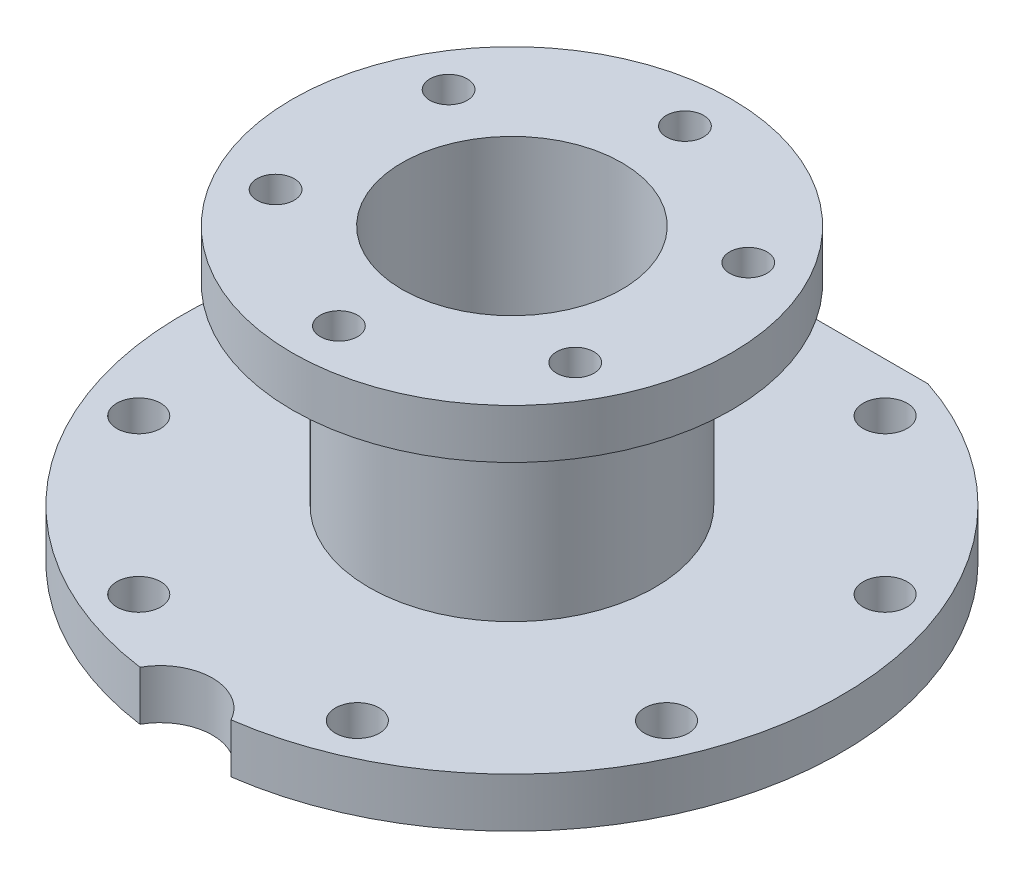
ISO-10303-21;
HEADER;
FILE_DESCRIPTION(('STEP AP214'),'2;1');
FILE_NAME('part.step','',(''),(''),'','','');
FILE_SCHEMA(('AUTOMOTIVE_DESIGN { 1 0 10303 214 1 1 1 1 }'));
ENDSEC;
DATA;
#1=APPLICATION_CONTEXT('core data for automotive mechanical design processes');
#2=APPLICATION_PROTOCOL_DEFINITION('international standard','automotive_design',2000,#1);
#3=PRODUCT_CONTEXT('',#1,'mechanical');
#4=PRODUCT('Part','Part','',(#3));
#5=PRODUCT_RELATED_PRODUCT_CATEGORY('part','',(#4));
#6=PRODUCT_DEFINITION_FORMATION('','',#4);
#7=PRODUCT_DEFINITION_CONTEXT('part definition',#1,'design');
#8=PRODUCT_DEFINITION('design','',#6,#7);
#9=PRODUCT_DEFINITION_SHAPE('','',#8);
#10=(LENGTH_UNIT() NAMED_UNIT(*) SI_UNIT(.MILLI.,.METRE.));
#11=(NAMED_UNIT(*) PLANE_ANGLE_UNIT() SI_UNIT($,.RADIAN.));
#12=(NAMED_UNIT(*) SI_UNIT($,.STERADIAN.) SOLID_ANGLE_UNIT());
#13=UNCERTAINTY_MEASURE_WITH_UNIT(LENGTH_MEASURE(1.E-05),#10,'distance_accuracy_value','');
#14=(GEOMETRIC_REPRESENTATION_CONTEXT(3) GLOBAL_UNCERTAINTY_ASSIGNED_CONTEXT((#13)) GLOBAL_UNIT_ASSIGNED_CONTEXT((#10,
#11,#12)) REPRESENTATION_CONTEXT('',''));
#15=CARTESIAN_POINT('',(0.,0.,0.));
#16=DIRECTION('',(0.,0.,1.));
#17=DIRECTION('',(1.,0.,0.));
#18=AXIS2_PLACEMENT_3D('',#15,#16,#17);
#19=CARTESIAN_POINT('',(0.,0.,0.));
#20=DIRECTION('',(0.,1.,0.));
#21=DIRECTION('',(0.,0.,1.));
#22=AXIS2_PLACEMENT_3D('',#19,#20,#21);
#23=CYLINDRICAL_SURFACE('',#22,20.);
#24=CARTESIAN_POINT('',(0.,53.,0.));
#25=DIRECTION('',(0.,1.,0.));
#26=DIRECTION('',(0.,0.,1.));
#27=AXIS2_PLACEMENT_3D('',#24,#25,#26);
#28=CIRCLE('',#27,20.);
#29=CARTESIAN_POINT('',(0.,53.,20.));
#30=VERTEX_POINT('',#29);
#31=EDGE_CURVE('E133',#30,#30,#28,.T.);
#32=ORIENTED_EDGE('',*,*,#31,.T.);
#33=EDGE_LOOP('',(#32));
#34=FACE_BOUND('',#33,.T.);
#35=CARTESIAN_POINT('',(0.,6.,0.));
#36=DIRECTION('',(0.,-1.,0.));
#37=DIRECTION('',(0.,0.,-1.));
#38=AXIS2_PLACEMENT_3D('',#35,#36,#37);
#39=CIRCLE('',#38,20.);
#40=CARTESIAN_POINT('',(0.,6.,-20.));
#41=VERTEX_POINT('',#40);
#42=EDGE_CURVE('E130',#41,#41,#39,.F.);
#43=ORIENTED_EDGE('',*,*,#42,.F.);
#44=EDGE_LOOP('',(#43));
#45=FACE_BOUND('',#44,.T.);
#46=ADVANCED_FACE('F43',(#34,#45),#23,.F.);
#47=CARTESIAN_POINT('',(0.,9.,0.));
#48=DIRECTION('',(0.,1.,0.));
#49=DIRECTION('',(0.,0.,1.));
#50=AXIS2_PLACEMENT_3D('',#47,#48,#49);
#51=PLANE('',#50);
#52=CARTESIAN_POINT('',(0.,9.,-31.5));
#53=DIRECTION('',(0.,1.,0.));
#54=DIRECTION('',(0.,0.,1.));
#55=AXIS2_PLACEMENT_3D('',#52,#53,#54);
#56=CIRCLE('',#55,1.5);
#57=CARTESIAN_POINT('',(0.,9.,-30.));
#58=VERTEX_POINT('',#57);
#59=EDGE_CURVE('E149',#58,#58,#56,.T.);
#60=ORIENTED_EDGE('',*,*,#59,.F.);
#61=EDGE_LOOP('',(#60));
#62=FACE_BOUND('',#61,.T.);
#63=CARTESIAN_POINT('',(0.,9.,0.));
#64=DIRECTION('',(0.,1.,0.));
#65=DIRECTION('',(0.,0.,1.));
#66=AXIS2_PLACEMENT_3D('',#63,#64,#65);
#67=CIRCLE('',#66,26.);
#68=CARTESIAN_POINT('',(0.,9.,26.));
#69=VERTEX_POINT('',#68);
#70=EDGE_CURVE('E205',#69,#69,#67,.T.);
#71=ORIENTED_EDGE('',*,*,#70,.F.);
#72=EDGE_LOOP('',(#71));
#73=FACE_BOUND('',#72,.T.);
#74=CARTESIAN_POINT('',(-19.8995384829828,9.,48.0417356905861));
#75=DIRECTION('',(0.,1.,0.));
#76=DIRECTION('',(0.,0.,1.));
#77=AXIS2_PLACEMENT_3D('',#74,#75,#76);
#78=CIRCLE('',#77,4.00000000000016);
#79=CARTESIAN_POINT('',(-19.8995384829828,9.,52.0417356905863));
#80=VERTEX_POINT('',#79);
#81=EDGE_CURVE('E225',#80,#80,#78,.T.);
#82=ORIENTED_EDGE('',*,*,#81,.F.);
#83=EDGE_LOOP('',(#82));
#84=FACE_BOUND('',#83,.T.);
#85=CARTESIAN_POINT('',(48.041735690588,9.,19.899538482982));
#86=DIRECTION('',(0.,1.,0.));
#87=DIRECTION('',(0.,0.,1.));
#88=AXIS2_PLACEMENT_3D('',#85,#86,#87);
#89=CIRCLE('',#88,4.00000000000213);
#90=CARTESIAN_POINT('',(48.041735690588,9.,23.8995384829841));
#91=VERTEX_POINT('',#90);
#92=EDGE_CURVE('E241',#91,#91,#89,.T.);
#93=ORIENTED_EDGE('',*,*,#92,.F.);
#94=EDGE_LOOP('',(#93));
#95=FACE_BOUND('',#94,.T.);
#96=CARTESIAN_POINT('',(19.8995384829839,9.,-48.0417356905888));
#97=DIRECTION('',(0.,1.,0.));
#98=DIRECTION('',(0.,0.,1.));
#99=AXIS2_PLACEMENT_3D('',#96,#97,#98);
#100=CIRCLE('',#99,4.00000000000223);
#101=CARTESIAN_POINT('',(19.8995384829839,9.,-44.0417356905866));
#102=VERTEX_POINT('',#101);
#103=EDGE_CURVE('E257',#102,#102,#100,.T.);
#104=ORIENTED_EDGE('',*,*,#103,.F.);
#105=EDGE_LOOP('',(#104));
#106=FACE_BOUND('',#105,.T.);
#107=CARTESIAN_POINT('',(-48.0417356905869,9.,-19.8995384829847));
#108=DIRECTION('',(0.,1.,0.));
#109=DIRECTION('',(0.,0.,1.));
#110=AXIS2_PLACEMENT_3D('',#107,#108,#109);
#111=CIRCLE('',#110,4.);
#112=CARTESIAN_POINT('',(-48.0417356905869,9.,-15.8995384829847));
#113=VERTEX_POINT('',#112);
#114=EDGE_CURVE('E120',#113,#113,#111,.T.);
#115=ORIENTED_EDGE('',*,*,#114,.F.);
#116=EDGE_LOOP('',(#115));
#117=FACE_BOUND('',#116,.T.);
#118=CARTESIAN_POINT('',(0.,9.,0.));
#119=DIRECTION('',(0.,1.,0.));
#120=DIRECTION('',(0.,0.,1.));
#121=AXIS2_PLACEMENT_3D('',#118,#119,#120);
#122=CIRCLE('',#121,60.);
#123=CARTESIAN_POINT('',(-18.7349939951952,9.,-57.));
#124=VERTEX_POINT('',#123);
#125=CARTESIAN_POINT('',(-8.29395796204773,9.,59.4239872553482));
#126=VERTEX_POINT('',#125);
#127=EDGE_CURVE('E99',#124,#126,#122,.T.);
#128=ORIENTED_EDGE('',*,*,#127,.T.);
#129=CARTESIAN_POINT('',(0.,9.,64.));
#130=DIRECTION('',(0.,-1.,0.));
#131=DIRECTION('',(0.,0.,1.));
#132=AXIS2_PLACEMENT_3D('',#129,#130,#131);
#133=CIRCLE('',#132,9.4725725816924);
#134=CARTESIAN_POINT('',(8.29395796204773,9.,59.4239872553482));
#135=VERTEX_POINT('',#134);
#136=EDGE_CURVE('E93',#126,#135,#133,.T.);
#137=ORIENTED_EDGE('',*,*,#136,.T.);
#138=CARTESIAN_POINT('',(0.,9.,0.));
#139=DIRECTION('',(0.,1.,0.));
#140=DIRECTION('',(0.,0.,1.));
#141=AXIS2_PLACEMENT_3D('',#138,#139,#140);
#142=CIRCLE('',#141,60.);
#143=CARTESIAN_POINT('',(18.7349939951952,9.,-57.));
#144=VERTEX_POINT('',#143);
#145=EDGE_CURVE('E97',#135,#144,#142,.T.);
#146=ORIENTED_EDGE('',*,*,#145,.T.);
#147=DIRECTION('',(-1.,0.,0.));
#148=VECTOR('',#147,1.);
#149=CARTESIAN_POINT('',(-18.7349939951952,9.,-57.));
#150=LINE('',#149,#148);
#151=EDGE_CURVE('E63',#144,#124,#150,.T.);
#152=ORIENTED_EDGE('',*,*,#151,.T.);
#153=EDGE_LOOP('',(#128,#137,#146,#152));
#154=FACE_BOUND('',#153,.T.);
#155=CARTESIAN_POINT('',(-19.8995384829845,9.,-48.041735690587));
#156=DIRECTION('',(0.,1.,0.));
#157=DIRECTION('',(0.,0.,1.));
#158=AXIS2_PLACEMENT_3D('',#155,#156,#157);
#159=CIRCLE('',#158,4.);
#160=CARTESIAN_POINT('',(-19.8995384829845,9.,-44.041735690587));
#161=VERTEX_POINT('',#160);
#162=EDGE_CURVE('E265',#161,#161,#159,.T.);
#163=ORIENTED_EDGE('',*,*,#162,.F.);
#164=EDGE_LOOP('',(#163));
#165=FACE_BOUND('',#164,.T.);
#166=CARTESIAN_POINT('',(48.0417356905869,9.,-19.8995384829874));
#167=DIRECTION('',(0.,1.,0.));
#168=DIRECTION('',(0.,0.,1.));
#169=AXIS2_PLACEMENT_3D('',#166,#167,#168);
#170=CIRCLE('',#169,4.0000000000026);
#171=CARTESIAN_POINT('',(48.0417356905869,9.,-15.8995384829848));
#172=VERTEX_POINT('',#171);
#173=EDGE_CURVE('E249',#172,#172,#170,.T.);
#174=ORIENTED_EDGE('',*,*,#173,.F.);
#175=EDGE_LOOP('',(#174));
#176=FACE_BOUND('',#175,.T.);
#177=CARTESIAN_POINT('',(19.8995384829866,9.,48.041735690585));
#178=DIRECTION('',(0.,1.,0.));
#179=DIRECTION('',(0.,0.,1.));
#180=AXIS2_PLACEMENT_3D('',#177,#178,#179);
#181=CIRCLE('',#180,4.0000000000011);
#182=CARTESIAN_POINT('',(19.8995384829866,9.,52.0417356905861));
#183=VERTEX_POINT('',#182);
#184=EDGE_CURVE('E233',#183,#183,#181,.T.);
#185=ORIENTED_EDGE('',*,*,#184,.F.);
#186=EDGE_LOOP('',(#185));
#187=FACE_BOUND('',#186,.T.);
#188=CARTESIAN_POINT('',(-48.0417356905872,9.,19.899538482984));
#189=DIRECTION('',(0.,1.,0.));
#190=DIRECTION('',(0.,0.,1.));
#191=AXIS2_PLACEMENT_3D('',#188,#189,#190);
#192=CIRCLE('',#191,4.);
#193=CARTESIAN_POINT('',(-48.0417356905872,9.,23.899538482984));
#194=VERTEX_POINT('',#193);
#195=EDGE_CURVE('E217',#194,#194,#192,.T.);
#196=ORIENTED_EDGE('',*,*,#195,.F.);
#197=EDGE_LOOP('',(#196));
#198=FACE_BOUND('',#197,.T.);
#199=ADVANCED_FACE('F94',(#62,#73,#84,#95,#106,#117,#154,#165,#176,#187,#198),#51,.T.);
#200=CARTESIAN_POINT('',(0.,0.,0.));
#201=DIRECTION('',(0.,1.,0.));
#202=DIRECTION('',(0.,0.,1.));
#203=AXIS2_PLACEMENT_3D('',#200,#201,#202);
#204=PLANE('',#203);
#205=CARTESIAN_POINT('',(0.,0.,0.));
#206=DIRECTION('',(0.,-1.,0.));
#207=DIRECTION('',(0.,0.,-1.));
#208=AXIS2_PLACEMENT_3D('',#205,#206,#207);
#209=CIRCLE('',#208,37.5);
#210=CARTESIAN_POINT('',(0.,0.,-37.5));
#211=VERTEX_POINT('',#210);
#212=EDGE_CURVE('E143',#211,#211,#209,.T.);
#213=ORIENTED_EDGE('',*,*,#212,.F.);
#214=EDGE_LOOP('',(#213));
#215=FACE_BOUND('',#214,.T.);
#216=CARTESIAN_POINT('',(0.,0.,0.));
#217=DIRECTION('',(0.,1.,0.));
#218=DIRECTION('',(0.,0.,1.));
#219=AXIS2_PLACEMENT_3D('',#216,#217,#218);
#220=CIRCLE('',#219,60.);
#221=CARTESIAN_POINT('',(-18.7349939951952,0.,-57.));
#222=VERTEX_POINT('',#221);
#223=CARTESIAN_POINT('',(-8.29395796204773,0.,59.4239872553482));
#224=VERTEX_POINT('',#223);
#225=EDGE_CURVE('E116',#222,#224,#220,.T.);
#226=ORIENTED_EDGE('',*,*,#225,.F.);
#227=DIRECTION('',(-1.,0.,0.));
#228=VECTOR('',#227,1.);
#229=CARTESIAN_POINT('',(-18.7349939951952,0.,-57.));
#230=LINE('',#229,#228);
#231=CARTESIAN_POINT('',(18.7349939951952,0.,-57.));
#232=VERTEX_POINT('',#231);
#233=EDGE_CURVE('E86',#232,#222,#230,.T.);
#234=ORIENTED_EDGE('',*,*,#233,.F.);
#235=CARTESIAN_POINT('',(0.,0.,0.));
#236=DIRECTION('',(0.,1.,0.));
#237=DIRECTION('',(0.,0.,1.));
#238=AXIS2_PLACEMENT_3D('',#235,#236,#237);
#239=CIRCLE('',#238,60.);
#240=CARTESIAN_POINT('',(8.29395796204773,0.,59.4239872553482));
#241=VERTEX_POINT('',#240);
#242=EDGE_CURVE('E80',#241,#232,#239,.T.);
#243=ORIENTED_EDGE('',*,*,#242,.F.);
#244=CARTESIAN_POINT('',(0.,0.,64.));
#245=DIRECTION('',(0.,-1.,0.));
#246=DIRECTION('',(0.,0.,1.));
#247=AXIS2_PLACEMENT_3D('',#244,#245,#246);
#248=CIRCLE('',#247,9.4725725816924);
#249=EDGE_CURVE('E104',#224,#241,#248,.T.);
#250=ORIENTED_EDGE('',*,*,#249,.F.);
#251=EDGE_LOOP('',(#226,#234,#243,#250));
#252=FACE_BOUND('',#251,.T.);
#253=CARTESIAN_POINT('',(-48.0417356905869,0.,-19.8995384829847));
#254=DIRECTION('',(0.,1.,0.));
#255=DIRECTION('',(0.,0.,1.));
#256=AXIS2_PLACEMENT_3D('',#253,#254,#255);
#257=CIRCLE('',#256,4.);
#258=CARTESIAN_POINT('',(-48.0417356905869,0.,-15.8995384829847));
#259=VERTEX_POINT('',#258);
#260=EDGE_CURVE('E269',#259,#259,#257,.T.);
#261=ORIENTED_EDGE('',*,*,#260,.T.);
#262=EDGE_LOOP('',(#261));
#263=FACE_BOUND('',#262,.T.);
#264=CARTESIAN_POINT('',(-19.8995384829845,0.,-48.041735690587));
#265=DIRECTION('',(0.,1.,0.));
#266=DIRECTION('',(0.,0.,1.));
#267=AXIS2_PLACEMENT_3D('',#264,#265,#266);
#268=CIRCLE('',#267,4.);
#269=CARTESIAN_POINT('',(-19.8995384829845,0.,-44.041735690587));
#270=VERTEX_POINT('',#269);
#271=EDGE_CURVE('E261',#270,#270,#268,.T.);
#272=ORIENTED_EDGE('',*,*,#271,.T.);
#273=EDGE_LOOP('',(#272));
#274=FACE_BOUND('',#273,.T.);
#275=CARTESIAN_POINT('',(19.8995384829839,0.,-48.0417356905888));
#276=DIRECTION('',(0.,1.,0.));
#277=DIRECTION('',(0.,0.,1.));
#278=AXIS2_PLACEMENT_3D('',#275,#276,#277);
#279=CIRCLE('',#278,4.00000000000223);
#280=CARTESIAN_POINT('',(19.8995384829839,0.,-44.0417356905866));
#281=VERTEX_POINT('',#280);
#282=EDGE_CURVE('E253',#281,#281,#279,.T.);
#283=ORIENTED_EDGE('',*,*,#282,.T.);
#284=EDGE_LOOP('',(#283));
#285=FACE_BOUND('',#284,.T.);
#286=CARTESIAN_POINT('',(48.0417356905869,0.,-19.8995384829874));
#287=DIRECTION('',(0.,1.,0.));
#288=DIRECTION('',(0.,0.,1.));
#289=AXIS2_PLACEMENT_3D('',#286,#287,#288);
#290=CIRCLE('',#289,4.0000000000026);
#291=CARTESIAN_POINT('',(48.0417356905869,0.,-15.8995384829848));
#292=VERTEX_POINT('',#291);
#293=EDGE_CURVE('E245',#292,#292,#290,.T.);
#294=ORIENTED_EDGE('',*,*,#293,.T.);
#295=EDGE_LOOP('',(#294));
#296=FACE_BOUND('',#295,.T.);
#297=CARTESIAN_POINT('',(48.041735690588,0.,19.899538482982));
#298=DIRECTION('',(0.,1.,0.));
#299=DIRECTION('',(0.,0.,1.));
#300=AXIS2_PLACEMENT_3D('',#297,#298,#299);
#301=CIRCLE('',#300,4.00000000000213);
#302=CARTESIAN_POINT('',(48.041735690588,0.,23.8995384829841));
#303=VERTEX_POINT('',#302);
#304=EDGE_CURVE('E237',#303,#303,#301,.T.);
#305=ORIENTED_EDGE('',*,*,#304,.T.);
#306=EDGE_LOOP('',(#305));
#307=FACE_BOUND('',#306,.T.);
#308=CARTESIAN_POINT('',(19.8995384829866,0.,48.041735690585));
#309=DIRECTION('',(0.,1.,0.));
#310=DIRECTION('',(0.,0.,1.));
#311=AXIS2_PLACEMENT_3D('',#308,#309,#310);
#312=CIRCLE('',#311,4.0000000000011);
#313=CARTESIAN_POINT('',(19.8995384829866,0.,52.0417356905861));
#314=VERTEX_POINT('',#313);
#315=EDGE_CURVE('E229',#314,#314,#312,.T.);
#316=ORIENTED_EDGE('',*,*,#315,.T.);
#317=EDGE_LOOP('',(#316));
#318=FACE_BOUND('',#317,.T.);
#319=CARTESIAN_POINT('',(-19.8995384829828,0.,48.0417356905861));
#320=DIRECTION('',(0.,1.,0.));
#321=DIRECTION('',(0.,0.,1.));
#322=AXIS2_PLACEMENT_3D('',#319,#320,#321);
#323=CIRCLE('',#322,4.00000000000016);
#324=CARTESIAN_POINT('',(-19.8995384829828,0.,52.0417356905863));
#325=VERTEX_POINT('',#324);
#326=EDGE_CURVE('E221',#325,#325,#323,.T.);
#327=ORIENTED_EDGE('',*,*,#326,.T.);
#328=EDGE_LOOP('',(#327));
#329=FACE_BOUND('',#328,.T.);
#330=CARTESIAN_POINT('',(-48.0417356905872,0.,19.899538482984));
#331=DIRECTION('',(0.,1.,0.));
#332=DIRECTION('',(0.,0.,1.));
#333=AXIS2_PLACEMENT_3D('',#330,#331,#332);
#334=CIRCLE('',#333,4.);
#335=CARTESIAN_POINT('',(-48.0417356905872,0.,23.899538482984));
#336=VERTEX_POINT('',#335);
#337=EDGE_CURVE('E213',#336,#336,#334,.T.);
#338=ORIENTED_EDGE('',*,*,#337,.T.);
#339=EDGE_LOOP('',(#338));
#340=FACE_BOUND('',#339,.T.);
#341=ADVANCED_FACE('F281',(#215,#252,#263,#274,#285,#296,#307,#318,#329,#340),#204,.F.);
#342=CARTESIAN_POINT('',(0.,9.,0.));
#343=DIRECTION('',(0.,-1.,0.));
#344=DIRECTION('',(0.,0.,-1.));
#345=AXIS2_PLACEMENT_3D('',#342,#343,#344);
#346=CYLINDRICAL_SURFACE('',#345,60.);
#347=ORIENTED_EDGE('',*,*,#225,.T.);
#348=DIRECTION('',(0.,-1.,0.));
#349=VECTOR('',#348,1.);
#350=CARTESIAN_POINT('',(-8.29395796204773,9.,59.4239872553482));
#351=LINE('',#350,#349);
#352=EDGE_CURVE('E11',#126,#224,#351,.T.);
#353=ORIENTED_EDGE('',*,*,#352,.F.);
#354=ORIENTED_EDGE('',*,*,#127,.F.);
#355=DIRECTION('',(0.,-1.,0.));
#356=VECTOR('',#355,1.);
#357=CARTESIAN_POINT('',(-18.7349939951952,9.,-57.));
#358=LINE('',#357,#356);
#359=EDGE_CURVE('E112',#124,#222,#358,.T.);
#360=ORIENTED_EDGE('',*,*,#359,.T.);
#361=EDGE_LOOP('',(#347,#353,#354,#360));
#362=FACE_BOUND('',#361,.T.);
#363=ADVANCED_FACE('F45',(#362),#346,.T.);
#364=CARTESIAN_POINT('',(0.,9.,64.));
#365=DIRECTION('',(0.,-1.,0.));
#366=DIRECTION('',(0.,0.,-1.));
#367=AXIS2_PLACEMENT_3D('',#364,#365,#366);
#368=CYLINDRICAL_SURFACE('',#367,9.4725725816924);
#369=ORIENTED_EDGE('',*,*,#249,.T.);
#370=DIRECTION('',(0.,-1.,0.));
#371=VECTOR('',#370,1.);
#372=CARTESIAN_POINT('',(8.29395796204773,9.,59.4239872553482));
#373=LINE('',#372,#371);
#374=EDGE_CURVE('E54',#135,#241,#373,.T.);
#375=ORIENTED_EDGE('',*,*,#374,.F.);
#376=ORIENTED_EDGE('',*,*,#136,.F.);
#377=ORIENTED_EDGE('',*,*,#352,.T.);
#378=EDGE_LOOP('',(#369,#375,#376,#377));
#379=FACE_BOUND('',#378,.T.);
#380=ADVANCED_FACE('F103',(#379),#368,.F.);
#381=CARTESIAN_POINT('',(0.,9.,0.));
#382=DIRECTION('',(0.,-1.,0.));
#383=DIRECTION('',(0.,0.,-1.));
#384=AXIS2_PLACEMENT_3D('',#381,#382,#383);
#385=CYLINDRICAL_SURFACE('',#384,60.);
#386=ORIENTED_EDGE('',*,*,#242,.T.);
#387=DIRECTION('',(0.,-1.,0.));
#388=VECTOR('',#387,1.);
#389=CARTESIAN_POINT('',(18.7349939951952,9.,-57.));
#390=LINE('',#389,#388);
#391=EDGE_CURVE('E106',#144,#232,#390,.T.);
#392=ORIENTED_EDGE('',*,*,#391,.F.);
#393=ORIENTED_EDGE('',*,*,#145,.F.);
#394=ORIENTED_EDGE('',*,*,#374,.T.);
#395=EDGE_LOOP('',(#386,#392,#393,#394));
#396=FACE_BOUND('',#395,.T.);
#397=ADVANCED_FACE('F108',(#396),#385,.T.);
#398=CARTESIAN_POINT('',(-18.7349939951952,9.,-57.));
#399=DIRECTION('',(0.,0.,1.));
#400=DIRECTION('',(1.,0.,0.));
#401=AXIS2_PLACEMENT_3D('',#398,#399,#400);
#402=PLANE('',#401);
#403=ORIENTED_EDGE('',*,*,#233,.T.);
#404=ORIENTED_EDGE('',*,*,#359,.F.);
#405=ORIENTED_EDGE('',*,*,#151,.F.);
#406=ORIENTED_EDGE('',*,*,#391,.T.);
#407=EDGE_LOOP('',(#403,#404,#405,#406));
#408=FACE_BOUND('',#407,.T.);
#409=ADVANCED_FACE('F287',(#408),#402,.F.);
#410=CARTESIAN_POINT('',(-48.0417356905869,9.,-19.8995384829847));
#411=DIRECTION('',(0.,-1.,0.));
#412=DIRECTION('',(0.,0.,-1.));
#413=AXIS2_PLACEMENT_3D('',#410,#411,#412);
#414=CYLINDRICAL_SURFACE('',#413,4.);
#415=ORIENTED_EDGE('',*,*,#114,.T.);
#416=EDGE_LOOP('',(#415));
#417=FACE_BOUND('',#416,.T.);
#418=ORIENTED_EDGE('',*,*,#260,.F.);
#419=EDGE_LOOP('',(#418));
#420=FACE_BOUND('',#419,.T.);
#421=ADVANCED_FACE('F284',(#417,#420),#414,.F.);
#422=CARTESIAN_POINT('',(-19.8995384829845,9.,-48.041735690587));
#423=DIRECTION('',(0.,-1.,0.));
#424=DIRECTION('',(0.,0.,-1.));
#425=AXIS2_PLACEMENT_3D('',#422,#423,#424);
#426=CYLINDRICAL_SURFACE('',#425,4.);
#427=ORIENTED_EDGE('',*,*,#162,.T.);
#428=EDGE_LOOP('',(#427));
#429=FACE_BOUND('',#428,.T.);
#430=ORIENTED_EDGE('',*,*,#271,.F.);
#431=EDGE_LOOP('',(#430));
#432=FACE_BOUND('',#431,.T.);
#433=ADVANCED_FACE('F286',(#429,#432),#426,.F.);
#434=CARTESIAN_POINT('',(19.8995384829839,9.,-48.0417356905888));
#435=DIRECTION('',(0.,-1.,0.));
#436=DIRECTION('',(0.,0.,-1.));
#437=AXIS2_PLACEMENT_3D('',#434,#435,#436);
#438=CYLINDRICAL_SURFACE('',#437,4.00000000000223);
#439=ORIENTED_EDGE('',*,*,#103,.T.);
#440=EDGE_LOOP('',(#439));
#441=FACE_BOUND('',#440,.T.);
#442=ORIENTED_EDGE('',*,*,#282,.F.);
#443=EDGE_LOOP('',(#442));
#444=FACE_BOUND('',#443,.T.);
#445=ADVANCED_FACE('F294',(#441,#444),#438,.F.);
#446=CARTESIAN_POINT('',(48.0417356905869,9.,-19.8995384829874));
#447=DIRECTION('',(0.,-1.,0.));
#448=DIRECTION('',(0.,0.,-1.));
#449=AXIS2_PLACEMENT_3D('',#446,#447,#448);
#450=CYLINDRICAL_SURFACE('',#449,4.0000000000026);
#451=ORIENTED_EDGE('',*,*,#173,.T.);
#452=EDGE_LOOP('',(#451));
#453=FACE_BOUND('',#452,.T.);
#454=ORIENTED_EDGE('',*,*,#293,.F.);
#455=EDGE_LOOP('',(#454));
#456=FACE_BOUND('',#455,.T.);
#457=ADVANCED_FACE('F367',(#453,#456),#450,.F.);
#458=CARTESIAN_POINT('',(48.041735690588,9.,19.899538482982));
#459=DIRECTION('',(0.,-1.,0.));
#460=DIRECTION('',(0.,0.,-1.));
#461=AXIS2_PLACEMENT_3D('',#458,#459,#460);
#462=CYLINDRICAL_SURFACE('',#461,4.00000000000213);
#463=ORIENTED_EDGE('',*,*,#92,.T.);
#464=EDGE_LOOP('',(#463));
#465=FACE_BOUND('',#464,.T.);
#466=ORIENTED_EDGE('',*,*,#304,.F.);
#467=EDGE_LOOP('',(#466));
#468=FACE_BOUND('',#467,.T.);
#469=ADVANCED_FACE('F363',(#465,#468),#462,.F.);
#470=CARTESIAN_POINT('',(19.8995384829866,9.,48.041735690585));
#471=DIRECTION('',(0.,-1.,0.));
#472=DIRECTION('',(0.,0.,-1.));
#473=AXIS2_PLACEMENT_3D('',#470,#471,#472);
#474=CYLINDRICAL_SURFACE('',#473,4.0000000000011);
#475=ORIENTED_EDGE('',*,*,#184,.T.);
#476=EDGE_LOOP('',(#475));
#477=FACE_BOUND('',#476,.T.);
#478=ORIENTED_EDGE('',*,*,#315,.F.);
#479=EDGE_LOOP('',(#478));
#480=FACE_BOUND('',#479,.T.);
#481=ADVANCED_FACE('F359',(#477,#480),#474,.F.);
#482=CARTESIAN_POINT('',(-19.8995384829828,9.,48.0417356905861));
#483=DIRECTION('',(0.,-1.,0.));
#484=DIRECTION('',(0.,0.,-1.));
#485=AXIS2_PLACEMENT_3D('',#482,#483,#484);
#486=CYLINDRICAL_SURFACE('',#485,4.00000000000016);
#487=ORIENTED_EDGE('',*,*,#81,.T.);
#488=EDGE_LOOP('',(#487));
#489=FACE_BOUND('',#488,.T.);
#490=ORIENTED_EDGE('',*,*,#326,.F.);
#491=EDGE_LOOP('',(#490));
#492=FACE_BOUND('',#491,.T.);
#493=ADVANCED_FACE('F355',(#489,#492),#486,.F.);
#494=CARTESIAN_POINT('',(-48.0417356905872,9.,19.899538482984));
#495=DIRECTION('',(0.,-1.,0.));
#496=DIRECTION('',(0.,0.,-1.));
#497=AXIS2_PLACEMENT_3D('',#494,#495,#496);
#498=CYLINDRICAL_SURFACE('',#497,4.);
#499=ORIENTED_EDGE('',*,*,#195,.T.);
#500=EDGE_LOOP('',(#499));
#501=FACE_BOUND('',#500,.T.);
#502=ORIENTED_EDGE('',*,*,#337,.F.);
#503=EDGE_LOOP('',(#502));
#504=FACE_BOUND('',#503,.T.);
#505=ADVANCED_FACE('F351',(#501,#504),#498,.F.);
#506=CARTESIAN_POINT('',(0.,44.,0.));
#507=DIRECTION('',(0.,-1.,0.));
#508=DIRECTION('',(0.,0.,-1.));
#509=AXIS2_PLACEMENT_3D('',#506,#507,#508);
#510=CYLINDRICAL_SURFACE('',#509,26.);
#511=CARTESIAN_POINT('',(0.,44.,0.));
#512=DIRECTION('',(0.,1.,0.));
#513=DIRECTION('',(0.,0.,1.));
#514=AXIS2_PLACEMENT_3D('',#511,#512,#513);
#515=CIRCLE('',#514,26.);
#516=CARTESIAN_POINT('',(0.,44.,26.));
#517=VERTEX_POINT('',#516);
#518=EDGE_CURVE('E209',#517,#517,#515,.T.);
#519=ORIENTED_EDGE('',*,*,#518,.F.);
#520=EDGE_LOOP('',(#519));
#521=FACE_BOUND('',#520,.T.);
#522=ORIENTED_EDGE('',*,*,#70,.T.);
#523=EDGE_LOOP('',(#522));
#524=FACE_BOUND('',#523,.T.);
#525=ADVANCED_FACE('F347',(#521,#524),#510,.T.);
#526=CARTESIAN_POINT('',(0.,53.,0.));
#527=DIRECTION('',(0.,-1.,0.));
#528=DIRECTION('',(0.,0.,-1.));
#529=AXIS2_PLACEMENT_3D('',#526,#527,#528);
#530=CYLINDRICAL_SURFACE('',#529,40.);
#531=CARTESIAN_POINT('',(0.,53.,0.));
#532=DIRECTION('',(0.,1.,0.));
#533=DIRECTION('',(0.,0.,1.));
#534=AXIS2_PLACEMENT_3D('',#531,#532,#533);
#535=CIRCLE('',#534,40.);
#536=CARTESIAN_POINT('',(0.,53.,40.));
#537=VERTEX_POINT('',#536);
#538=EDGE_CURVE('E201',#537,#537,#535,.T.);
#539=ORIENTED_EDGE('',*,*,#538,.F.);
#540=EDGE_LOOP('',(#539));
#541=FACE_BOUND('',#540,.T.);
#542=CARTESIAN_POINT('',(0.,44.,0.));
#543=DIRECTION('',(0.,1.,0.));
#544=DIRECTION('',(0.,0.,1.));
#545=AXIS2_PLACEMENT_3D('',#542,#543,#544);
#546=CIRCLE('',#545,40.);
#547=CARTESIAN_POINT('',(0.,44.,40.));
#548=VERTEX_POINT('',#547);
#549=EDGE_CURVE('E200',#548,#548,#546,.T.);
#550=ORIENTED_EDGE('',*,*,#549,.T.);
#551=EDGE_LOOP('',(#550));
#552=FACE_BOUND('',#551,.T.);
#553=ADVANCED_FACE('F340',(#541,#552),#530,.T.);
#554=CARTESIAN_POINT('',(0.,53.,0.));
#555=DIRECTION('',(0.,1.,0.));
#556=DIRECTION('',(0.,0.,1.));
#557=AXIS2_PLACEMENT_3D('',#554,#555,#556);
#558=PLANE('',#557);
#559=ORIENTED_EDGE('',*,*,#31,.F.);
#560=EDGE_LOOP('',(#559));
#561=FACE_BOUND('',#560,.T.);
#562=CARTESIAN_POINT('',(-27.2798002192096,53.,-15.7500000000003));
#563=DIRECTION('',(0.,1.,0.));
#564=DIRECTION('',(0.,0.,1.));
#565=AXIS2_PLACEMENT_3D('',#562,#563,#564);
#566=CIRCLE('',#565,3.39999999999999);
#567=CARTESIAN_POINT('',(-27.2798002192096,53.,-12.3500000000003));
#568=VERTEX_POINT('',#567);
#569=EDGE_CURVE('E140',#568,#568,#566,.T.);
#570=ORIENTED_EDGE('',*,*,#569,.F.);
#571=EDGE_LOOP('',(#570));
#572=FACE_BOUND('',#571,.T.);
#573=CARTESIAN_POINT('',(-27.27980021921,53.,15.7499999999997));
#574=DIRECTION('',(0.,1.,0.));
#575=DIRECTION('',(0.,0.,1.));
#576=AXIS2_PLACEMENT_3D('',#573,#574,#575);
#577=CIRCLE('',#576,3.39999999999999);
#578=CARTESIAN_POINT('',(-27.27980021921,53.,19.1499999999997));
#579=VERTEX_POINT('',#578);
#580=EDGE_CURVE('E160',#579,#579,#577,.T.);
#581=ORIENTED_EDGE('',*,*,#580,.F.);
#582=EDGE_LOOP('',(#581));
#583=FACE_BOUND('',#582,.T.);
#584=CARTESIAN_POINT('',(0.,53.,31.5));
#585=DIRECTION('',(0.,1.,0.));
#586=DIRECTION('',(0.,0.,1.));
#587=AXIS2_PLACEMENT_3D('',#584,#585,#586);
#588=CIRCLE('',#587,3.39999999999999);
#589=CARTESIAN_POINT('',(0.,53.,34.9));
#590=VERTEX_POINT('',#589);
#591=EDGE_CURVE('E168',#590,#590,#588,.T.);
#592=ORIENTED_EDGE('',*,*,#591,.F.);
#593=EDGE_LOOP('',(#592));
#594=FACE_BOUND('',#593,.T.);
#595=CARTESIAN_POINT('',(27.2798002192098,53.,15.7500000000001));
#596=DIRECTION('',(0.,1.,0.));
#597=DIRECTION('',(0.,0.,1.));
#598=AXIS2_PLACEMENT_3D('',#595,#596,#597);
#599=CIRCLE('',#598,3.39999999999999);
#600=CARTESIAN_POINT('',(27.2798002192098,53.,19.1500000000001));
#601=VERTEX_POINT('',#600);
#602=EDGE_CURVE('E176',#601,#601,#599,.T.);
#603=ORIENTED_EDGE('',*,*,#602,.F.);
#604=EDGE_LOOP('',(#603));
#605=FACE_BOUND('',#604,.T.);
#606=CARTESIAN_POINT('',(27.2798002192099,53.,-15.7499999999999));
#607=DIRECTION('',(0.,1.,0.));
#608=DIRECTION('',(0.,0.,1.));
#609=AXIS2_PLACEMENT_3D('',#606,#607,#608);
#610=CIRCLE('',#609,3.39999999999999);
#611=CARTESIAN_POINT('',(27.2798002192099,53.,-12.3499999999999));
#612=VERTEX_POINT('',#611);
#613=EDGE_CURVE('E184',#612,#612,#610,.T.);
#614=ORIENTED_EDGE('',*,*,#613,.F.);
#615=EDGE_LOOP('',(#614));
#616=FACE_BOUND('',#615,.T.);
#617=CARTESIAN_POINT('',(0.,53.,-31.5));
#618=DIRECTION('',(0.,1.,0.));
#619=DIRECTION('',(0.,0.,1.));
#620=AXIS2_PLACEMENT_3D('',#617,#618,#619);
#621=CIRCLE('',#620,3.39999999999999);
#622=CARTESIAN_POINT('',(0.,53.,-28.1));
#623=VERTEX_POINT('',#622);
#624=EDGE_CURVE('E192',#623,#623,#621,.T.);
#625=ORIENTED_EDGE('',*,*,#624,.F.);
#626=EDGE_LOOP('',(#625));
#627=FACE_BOUND('',#626,.T.);
#628=ORIENTED_EDGE('',*,*,#538,.T.);
#629=EDGE_LOOP('',(#628));
#630=FACE_BOUND('',#629,.T.);
#631=ADVANCED_FACE('F337',(#561,#572,#583,#594,#605,#616,#627,#630),#558,.T.);
#632=CARTESIAN_POINT('',(0.,44.,0.));
#633=DIRECTION('',(0.,1.,0.));
#634=DIRECTION('',(0.,0.,1.));
#635=AXIS2_PLACEMENT_3D('',#632,#633,#634);
#636=PLANE('',#635);
#637=CARTESIAN_POINT('',(-27.2798002192096,44.,-15.7500000000003));
#638=DIRECTION('',(0.,1.,0.));
#639=DIRECTION('',(0.,0.,1.));
#640=AXIS2_PLACEMENT_3D('',#637,#638,#639);
#641=CIRCLE('',#640,3.39999999999999);
#642=CARTESIAN_POINT('',(-27.2798002192096,44.,-12.3500000000003));
#643=VERTEX_POINT('',#642);
#644=EDGE_CURVE('E156',#643,#643,#641,.T.);
#645=ORIENTED_EDGE('',*,*,#644,.T.);
#646=EDGE_LOOP('',(#645));
#647=FACE_BOUND('',#646,.T.);
#648=CARTESIAN_POINT('',(-27.27980021921,44.,15.7499999999997));
#649=DIRECTION('',(0.,1.,0.));
#650=DIRECTION('',(0.,0.,1.));
#651=AXIS2_PLACEMENT_3D('',#648,#649,#650);
#652=CIRCLE('',#651,3.39999999999999);
#653=CARTESIAN_POINT('',(-27.27980021921,44.,19.1499999999997));
#654=VERTEX_POINT('',#653);
#655=EDGE_CURVE('E164',#654,#654,#652,.T.);
#656=ORIENTED_EDGE('',*,*,#655,.T.);
#657=EDGE_LOOP('',(#656));
#658=FACE_BOUND('',#657,.T.);
#659=CARTESIAN_POINT('',(0.,44.,31.5));
#660=DIRECTION('',(0.,1.,0.));
#661=DIRECTION('',(0.,0.,1.));
#662=AXIS2_PLACEMENT_3D('',#659,#660,#661);
#663=CIRCLE('',#662,3.39999999999999);
#664=CARTESIAN_POINT('',(0.,44.,34.9));
#665=VERTEX_POINT('',#664);
#666=EDGE_CURVE('E172',#665,#665,#663,.T.);
#667=ORIENTED_EDGE('',*,*,#666,.T.);
#668=EDGE_LOOP('',(#667));
#669=FACE_BOUND('',#668,.T.);
#670=CARTESIAN_POINT('',(27.2798002192098,44.,15.7500000000001));
#671=DIRECTION('',(0.,1.,0.));
#672=DIRECTION('',(0.,0.,1.));
#673=AXIS2_PLACEMENT_3D('',#670,#671,#672);
#674=CIRCLE('',#673,3.39999999999999);
#675=CARTESIAN_POINT('',(27.2798002192098,44.,19.1500000000001));
#676=VERTEX_POINT('',#675);
#677=EDGE_CURVE('E180',#676,#676,#674,.T.);
#678=ORIENTED_EDGE('',*,*,#677,.T.);
#679=EDGE_LOOP('',(#678));
#680=FACE_BOUND('',#679,.T.);
#681=CARTESIAN_POINT('',(27.2798002192099,44.,-15.7499999999999));
#682=DIRECTION('',(0.,1.,0.));
#683=DIRECTION('',(0.,0.,1.));
#684=AXIS2_PLACEMENT_3D('',#681,#682,#683);
#685=CIRCLE('',#684,3.39999999999999);
#686=CARTESIAN_POINT('',(27.2798002192099,44.,-12.3499999999999));
#687=VERTEX_POINT('',#686);
#688=EDGE_CURVE('E188',#687,#687,#685,.T.);
#689=ORIENTED_EDGE('',*,*,#688,.T.);
#690=EDGE_LOOP('',(#689));
#691=FACE_BOUND('',#690,.T.);
#692=CARTESIAN_POINT('',(0.,44.,-31.5));
#693=DIRECTION('',(0.,1.,0.));
#694=DIRECTION('',(0.,0.,1.));
#695=AXIS2_PLACEMENT_3D('',#692,#693,#694);
#696=CIRCLE('',#695,3.39999999999999);
#697=CARTESIAN_POINT('',(0.,44.,-28.1));
#698=VERTEX_POINT('',#697);
#699=EDGE_CURVE('E196',#698,#698,#696,.T.);
#700=ORIENTED_EDGE('',*,*,#699,.T.);
#701=EDGE_LOOP('',(#700));
#702=FACE_BOUND('',#701,.T.);
#703=ORIENTED_EDGE('',*,*,#518,.T.);
#704=EDGE_LOOP('',(#703));
#705=FACE_BOUND('',#704,.T.);
#706=ORIENTED_EDGE('',*,*,#549,.F.);
#707=EDGE_LOOP('',(#706));
#708=FACE_BOUND('',#707,.T.);
#709=ADVANCED_FACE('F335',(#647,#658,#669,#680,#691,#702,#705,#708),#636,.F.);
#710=CARTESIAN_POINT('',(0.,53.,-31.5));
#711=DIRECTION('',(0.,1.,0.));
#712=DIRECTION('',(0.,0.,1.));
#713=AXIS2_PLACEMENT_3D('',#710,#711,#712);
#714=CYLINDRICAL_SURFACE('',#713,3.39999999999999);
#715=ORIENTED_EDGE('',*,*,#699,.F.);
#716=EDGE_LOOP('',(#715));
#717=FACE_BOUND('',#716,.T.);
#718=ORIENTED_EDGE('',*,*,#624,.T.);
#719=EDGE_LOOP('',(#718));
#720=FACE_BOUND('',#719,.T.);
#721=ADVANCED_FACE('F331',(#717,#720),#714,.F.);
#722=CARTESIAN_POINT('',(27.2798002192099,53.,-15.7499999999999));
#723=DIRECTION('',(0.,1.,0.));
#724=DIRECTION('',(0.,0.,1.));
#725=AXIS2_PLACEMENT_3D('',#722,#723,#724);
#726=CYLINDRICAL_SURFACE('',#725,3.39999999999999);
#727=ORIENTED_EDGE('',*,*,#688,.F.);
#728=EDGE_LOOP('',(#727));
#729=FACE_BOUND('',#728,.T.);
#730=ORIENTED_EDGE('',*,*,#613,.T.);
#731=EDGE_LOOP('',(#730));
#732=FACE_BOUND('',#731,.T.);
#733=ADVANCED_FACE('F327',(#729,#732),#726,.F.);
#734=CARTESIAN_POINT('',(27.2798002192098,53.,15.7500000000001));
#735=DIRECTION('',(0.,1.,0.));
#736=DIRECTION('',(0.,0.,1.));
#737=AXIS2_PLACEMENT_3D('',#734,#735,#736);
#738=CYLINDRICAL_SURFACE('',#737,3.39999999999999);
#739=ORIENTED_EDGE('',*,*,#677,.F.);
#740=EDGE_LOOP('',(#739));
#741=FACE_BOUND('',#740,.T.);
#742=ORIENTED_EDGE('',*,*,#602,.T.);
#743=EDGE_LOOP('',(#742));
#744=FACE_BOUND('',#743,.T.);
#745=ADVANCED_FACE('F323',(#741,#744),#738,.F.);
#746=CARTESIAN_POINT('',(0.,53.,31.5));
#747=DIRECTION('',(0.,1.,0.));
#748=DIRECTION('',(0.,0.,1.));
#749=AXIS2_PLACEMENT_3D('',#746,#747,#748);
#750=CYLINDRICAL_SURFACE('',#749,3.39999999999999);
#751=ORIENTED_EDGE('',*,*,#666,.F.);
#752=EDGE_LOOP('',(#751));
#753=FACE_BOUND('',#752,.T.);
#754=ORIENTED_EDGE('',*,*,#591,.T.);
#755=EDGE_LOOP('',(#754));
#756=FACE_BOUND('',#755,.T.);
#757=ADVANCED_FACE('F319',(#753,#756),#750,.F.);
#758=CARTESIAN_POINT('',(-27.27980021921,53.,15.7499999999997));
#759=DIRECTION('',(0.,1.,0.));
#760=DIRECTION('',(0.,0.,1.));
#761=AXIS2_PLACEMENT_3D('',#758,#759,#760);
#762=CYLINDRICAL_SURFACE('',#761,3.39999999999999);
#763=ORIENTED_EDGE('',*,*,#655,.F.);
#764=EDGE_LOOP('',(#763));
#765=FACE_BOUND('',#764,.T.);
#766=ORIENTED_EDGE('',*,*,#580,.T.);
#767=EDGE_LOOP('',(#766));
#768=FACE_BOUND('',#767,.T.);
#769=ADVANCED_FACE('F315',(#765,#768),#762,.F.);
#770=CARTESIAN_POINT('',(-27.2798002192096,53.,-15.7500000000003));
#771=DIRECTION('',(0.,1.,0.));
#772=DIRECTION('',(0.,0.,1.));
#773=AXIS2_PLACEMENT_3D('',#770,#771,#772);
#774=CYLINDRICAL_SURFACE('',#773,3.39999999999999);
#775=ORIENTED_EDGE('',*,*,#644,.F.);
#776=EDGE_LOOP('',(#775));
#777=FACE_BOUND('',#776,.T.);
#778=ORIENTED_EDGE('',*,*,#569,.T.);
#779=EDGE_LOOP('',(#778));
#780=FACE_BOUND('',#779,.T.);
#781=ADVANCED_FACE('F311',(#777,#780),#774,.F.);
#782=CARTESIAN_POINT('',(0.,6.,0.));
#783=DIRECTION('',(0.,-1.,0.));
#784=DIRECTION('',(0.,0.,-1.));
#785=AXIS2_PLACEMENT_3D('',#782,#783,#784);
#786=PLANE('',#785);
#787=CARTESIAN_POINT('',(0.,6.,-31.5));
#788=DIRECTION('',(0.,-1.,0.));
#789=DIRECTION('',(0.,0.,-1.));
#790=AXIS2_PLACEMENT_3D('',#787,#788,#789);
#791=CIRCLE('',#790,1.5);
#792=CARTESIAN_POINT('',(0.,6.,-33.));
#793=VERTEX_POINT('',#792);
#794=EDGE_CURVE('E47',#793,#793,#791,.T.);
#795=ORIENTED_EDGE('',*,*,#794,.F.);
#796=EDGE_LOOP('',(#795));
#797=FACE_BOUND('',#796,.T.);
#798=CARTESIAN_POINT('',(0.,6.,0.));
#799=DIRECTION('',(0.,-1.,0.));
#800=DIRECTION('',(0.,0.,-1.));
#801=AXIS2_PLACEMENT_3D('',#798,#799,#800);
#802=CIRCLE('',#801,37.5);
#803=CARTESIAN_POINT('',(0.,6.,-37.5));
#804=VERTEX_POINT('',#803);
#805=EDGE_CURVE('E134',#804,#804,#802,.T.);
#806=ORIENTED_EDGE('',*,*,#805,.T.);
#807=EDGE_LOOP('',(#806));
#808=FACE_BOUND('',#807,.T.);
#809=ORIENTED_EDGE('',*,*,#42,.T.);
#810=EDGE_LOOP('',(#809));
#811=FACE_BOUND('',#810,.T.);
#812=ADVANCED_FACE('F314',(#797,#808,#811),#786,.T.);
#813=CARTESIAN_POINT('',(0.,6.,0.));
#814=DIRECTION('',(0.,-1.,0.));
#815=DIRECTION('',(0.,0.,-1.));
#816=AXIS2_PLACEMENT_3D('',#813,#814,#815);
#817=CYLINDRICAL_SURFACE('',#816,37.5);
#818=ORIENTED_EDGE('',*,*,#805,.F.);
#819=EDGE_LOOP('',(#818));
#820=FACE_BOUND('',#819,.T.);
#821=ORIENTED_EDGE('',*,*,#212,.T.);
#822=EDGE_LOOP('',(#821));
#823=FACE_BOUND('',#822,.T.);
#824=ADVANCED_FACE('F309',(#820,#823),#817,.F.);
#825=CARTESIAN_POINT('',(0.,0.,-31.5));
#826=DIRECTION('',(0.,1.,0.));
#827=DIRECTION('',(0.,0.,1.));
#828=AXIS2_PLACEMENT_3D('',#825,#826,#827);
#829=CYLINDRICAL_SURFACE('',#828,1.5);
#830=ORIENTED_EDGE('',*,*,#59,.T.);
#831=EDGE_LOOP('',(#830));
#832=FACE_BOUND('',#831,.T.);
#833=ORIENTED_EDGE('',*,*,#794,.T.);
#834=EDGE_LOOP('',(#833));
#835=FACE_BOUND('',#834,.T.);
#836=ADVANCED_FACE('F559',(#832,#835),#829,.F.);
#837=CLOSED_SHELL('',(#46,#199,#341,#363,#380,#397,#409,#421,#433,#445,#457,#469,#481,#493,#505,
#525,#553,#631,#709,#721,#733,#745,#757,#769,#781,#812,#824,#836));
#838=MANIFOLD_SOLID_BREP('B2',#837);
#839=ADVANCED_BREP_SHAPE_REPRESENTATION('',(#18,#838),#14);
#840=SHAPE_DEFINITION_REPRESENTATION(#9,#839);
ENDSEC;
END-ISO-10303-21;
